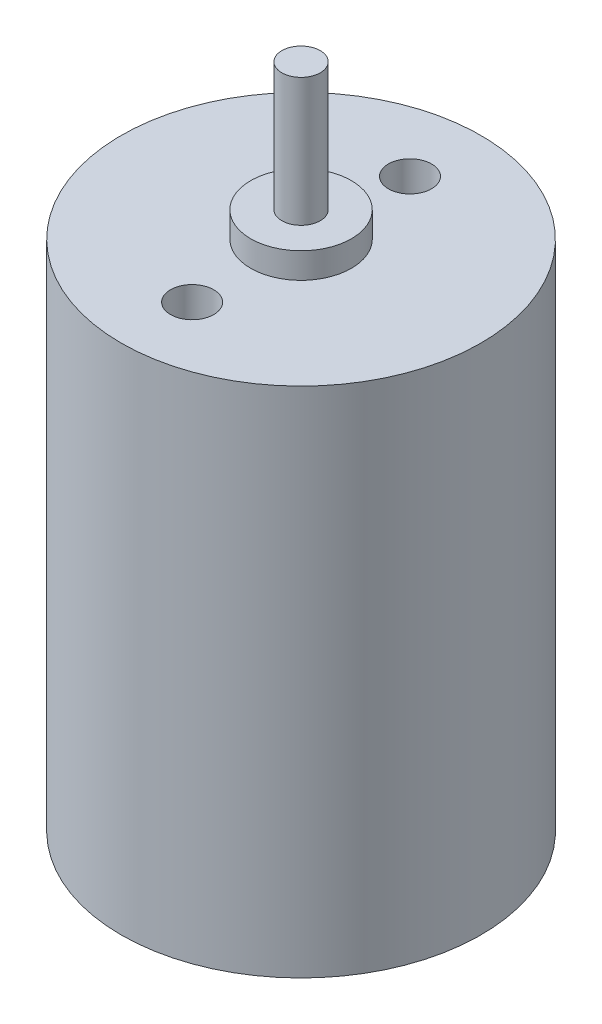
ISO-10303-21;
HEADER;
FILE_DESCRIPTION(('STEP AP214'),'2;1');
FILE_NAME('part.step','',(''),(''),'','','');
FILE_SCHEMA(('AUTOMOTIVE_DESIGN { 1 0 10303 214 1 1 1 1 }'));
ENDSEC;
DATA;
#1=APPLICATION_CONTEXT('core data for automotive mechanical design processes');
#2=APPLICATION_PROTOCOL_DEFINITION('international standard','automotive_design',2000,#1);
#3=PRODUCT_CONTEXT('',#1,'mechanical');
#4=PRODUCT('Part','Part','',(#3));
#5=PRODUCT_RELATED_PRODUCT_CATEGORY('part','',(#4));
#6=PRODUCT_DEFINITION_FORMATION('','',#4);
#7=PRODUCT_DEFINITION_CONTEXT('part definition',#1,'design');
#8=PRODUCT_DEFINITION('design','',#6,#7);
#9=PRODUCT_DEFINITION_SHAPE('','',#8);
#10=(LENGTH_UNIT() NAMED_UNIT(*) SI_UNIT(.MILLI.,.METRE.));
#11=(NAMED_UNIT(*) PLANE_ANGLE_UNIT() SI_UNIT($,.RADIAN.));
#12=(NAMED_UNIT(*) SI_UNIT($,.STERADIAN.) SOLID_ANGLE_UNIT());
#13=UNCERTAINTY_MEASURE_WITH_UNIT(LENGTH_MEASURE(1.E-05),#10,'distance_accuracy_value','');
#14=(GEOMETRIC_REPRESENTATION_CONTEXT(3) GLOBAL_UNCERTAINTY_ASSIGNED_CONTEXT((#13)) GLOBAL_UNIT_ASSIGNED_CONTEXT((#10,
#11,#12)) REPRESENTATION_CONTEXT('',''));
#15=CARTESIAN_POINT('',(0.,0.,0.));
#16=DIRECTION('',(0.,0.,1.));
#17=DIRECTION('',(1.,0.,0.));
#18=AXIS2_PLACEMENT_3D('',#15,#16,#17);
#19=CARTESIAN_POINT('',(0.,-40.,0.));
#20=DIRECTION('',(0.,1.,0.));
#21=DIRECTION('',(0.,0.,1.));
#22=AXIS2_PLACEMENT_3D('',#19,#20,#21);
#23=CYLINDRICAL_SURFACE('',#22,14.0362952781389);
#24=CARTESIAN_POINT('',(0.,-40.,0.));
#25=DIRECTION('',(0.,1.,0.));
#26=DIRECTION('',(0.,0.,1.));
#27=AXIS2_PLACEMENT_3D('',#24,#25,#26);
#28=CIRCLE('',#27,14.0362952781389);
#29=CARTESIAN_POINT('',(0.,-40.,14.0362952781389));
#30=VERTEX_POINT('',#29);
#31=EDGE_CURVE('E46',#30,#30,#28,.T.);
#32=ORIENTED_EDGE('',*,*,#31,.T.);
#33=EDGE_LOOP('',(#32));
#34=FACE_BOUND('',#33,.T.);
#35=CARTESIAN_POINT('',(0.,0.,0.));
#36=DIRECTION('',(0.,1.,0.));
#37=DIRECTION('',(0.,0.,1.));
#38=AXIS2_PLACEMENT_3D('',#35,#36,#37);
#39=CIRCLE('',#38,14.0362952781389);
#40=CARTESIAN_POINT('',(0.,0.,14.0362952781389));
#41=VERTEX_POINT('',#40);
#42=EDGE_CURVE('E51',#41,#41,#39,.T.);
#43=ORIENTED_EDGE('',*,*,#42,.F.);
#44=EDGE_LOOP('',(#43));
#45=FACE_BOUND('',#44,.T.);
#46=ADVANCED_FACE('F39',(#34,#45),#23,.T.);
#47=CARTESIAN_POINT('',(0.,-40.,0.));
#48=DIRECTION('',(0.,1.,0.));
#49=DIRECTION('',(0.,0.,1.));
#50=AXIS2_PLACEMENT_3D('',#47,#48,#49);
#51=PLANE('',#50);
#52=ORIENTED_EDGE('',*,*,#31,.F.);
#53=EDGE_LOOP('',(#52));
#54=FACE_BOUND('',#53,.T.);
#55=ADVANCED_FACE('F90',(#54),#51,.F.);
#56=CARTESIAN_POINT('',(0.,0.,0.));
#57=DIRECTION('',(0.,1.,0.));
#58=DIRECTION('',(0.,0.,1.));
#59=AXIS2_PLACEMENT_3D('',#56,#57,#58);
#60=PLANE('',#59);
#61=CARTESIAN_POINT('',(0.,0.,-8.5));
#62=DIRECTION('',(0.,1.,0.));
#63=DIRECTION('',(0.,0.,1.));
#64=AXIS2_PLACEMENT_3D('',#61,#62,#63);
#65=CIRCLE('',#64,1.68435543337666);
#66=CARTESIAN_POINT('',(0.,0.,-6.81564456662334));
#67=VERTEX_POINT('',#66);
#68=EDGE_CURVE('E72',#67,#67,#65,.T.);
#69=ORIENTED_EDGE('',*,*,#68,.F.);
#70=EDGE_LOOP('',(#69));
#71=FACE_BOUND('',#70,.T.);
#72=CARTESIAN_POINT('',(0.,0.,8.5));
#73=DIRECTION('',(0.,1.,0.));
#74=DIRECTION('',(0.,0.,1.));
#75=AXIS2_PLACEMENT_3D('',#72,#73,#74);
#76=CIRCLE('',#75,1.68435543337666);
#77=CARTESIAN_POINT('',(0.,0.,10.1843554333767));
#78=VERTEX_POINT('',#77);
#79=EDGE_CURVE('E79',#78,#78,#76,.T.);
#80=ORIENTED_EDGE('',*,*,#79,.F.);
#81=EDGE_LOOP('',(#80));
#82=FACE_BOUND('',#81,.T.);
#83=CARTESIAN_POINT('',(0.,0.,0.));
#84=DIRECTION('',(0.,1.,0.));
#85=DIRECTION('',(0.,0.,1.));
#86=AXIS2_PLACEMENT_3D('',#83,#84,#85);
#87=CIRCLE('',#86,3.93016267787888);
#88=CARTESIAN_POINT('',(0.,0.,3.93016267787888));
#89=VERTEX_POINT('',#88);
#90=EDGE_CURVE('E10',#89,#89,#87,.T.);
#91=ORIENTED_EDGE('',*,*,#90,.F.);
#92=EDGE_LOOP('',(#91));
#93=FACE_BOUND('',#92,.T.);
#94=ORIENTED_EDGE('',*,*,#42,.T.);
#95=EDGE_LOOP('',(#94));
#96=FACE_BOUND('',#95,.T.);
#97=ADVANCED_FACE('F83',(#71,#82,#93,#96),#60,.T.);
#98=CARTESIAN_POINT('',(0.,2.,0.));
#99=DIRECTION('',(0.,-1.,0.));
#100=DIRECTION('',(0.,0.,-1.));
#101=AXIS2_PLACEMENT_3D('',#98,#99,#100);
#102=CYLINDRICAL_SURFACE('',#101,3.93016267787888);
#103=CARTESIAN_POINT('',(0.,2.,0.));
#104=DIRECTION('',(0.,1.,0.));
#105=DIRECTION('',(0.,0.,1.));
#106=AXIS2_PLACEMENT_3D('',#103,#104,#105);
#107=CIRCLE('',#106,3.93016267787888);
#108=CARTESIAN_POINT('',(0.,2.,3.93016267787888));
#109=VERTEX_POINT('',#108);
#110=EDGE_CURVE('E53',#109,#109,#107,.T.);
#111=ORIENTED_EDGE('',*,*,#110,.F.);
#112=EDGE_LOOP('',(#111));
#113=FACE_BOUND('',#112,.T.);
#114=ORIENTED_EDGE('',*,*,#90,.T.);
#115=EDGE_LOOP('',(#114));
#116=FACE_BOUND('',#115,.T.);
#117=ADVANCED_FACE('F86',(#113,#116),#102,.T.);
#118=CARTESIAN_POINT('',(0.,2.,0.));
#119=DIRECTION('',(0.,1.,0.));
#120=DIRECTION('',(0.,0.,1.));
#121=AXIS2_PLACEMENT_3D('',#118,#119,#120);
#122=PLANE('',#121);
#123=CARTESIAN_POINT('',(0.,2.,0.));
#124=DIRECTION('',(0.,1.,0.));
#125=DIRECTION('',(0.,0.,1.));
#126=AXIS2_PLACEMENT_3D('',#123,#124,#125);
#127=CIRCLE('',#126,1.5);
#128=CARTESIAN_POINT('',(0.,2.,1.5));
#129=VERTEX_POINT('',#128);
#130=EDGE_CURVE('E45',#129,#129,#127,.F.);
#131=ORIENTED_EDGE('',*,*,#130,.T.);
#132=EDGE_LOOP('',(#131));
#133=FACE_BOUND('',#132,.T.);
#134=ORIENTED_EDGE('',*,*,#110,.T.);
#135=EDGE_LOOP('',(#134));
#136=FACE_BOUND('',#135,.T.);
#137=ADVANCED_FACE('F124',(#133,#136),#122,.T.);
#138=CARTESIAN_POINT('',(0.,12.,0.));
#139=DIRECTION('',(0.,-1.,0.));
#140=DIRECTION('',(0.,0.,-1.));
#141=AXIS2_PLACEMENT_3D('',#138,#139,#140);
#142=CYLINDRICAL_SURFACE('',#141,1.5);
#143=ORIENTED_EDGE('',*,*,#130,.F.);
#144=EDGE_LOOP('',(#143));
#145=FACE_BOUND('',#144,.T.);
#146=CARTESIAN_POINT('',(0.,12.,0.));
#147=DIRECTION('',(0.,1.,0.));
#148=DIRECTION('',(0.,0.,1.));
#149=AXIS2_PLACEMENT_3D('',#146,#147,#148);
#150=CIRCLE('',#149,1.5);
#151=CARTESIAN_POINT('',(0.,12.,1.5));
#152=VERTEX_POINT('',#151);
#153=EDGE_CURVE('E65',#152,#152,#150,.T.);
#154=ORIENTED_EDGE('',*,*,#153,.F.);
#155=EDGE_LOOP('',(#154));
#156=FACE_BOUND('',#155,.T.);
#157=ADVANCED_FACE('F104',(#145,#156),#142,.T.);
#158=CARTESIAN_POINT('',(0.,12.,0.));
#159=DIRECTION('',(0.,1.,0.));
#160=DIRECTION('',(0.,0.,1.));
#161=AXIS2_PLACEMENT_3D('',#158,#159,#160);
#162=PLANE('',#161);
#163=ORIENTED_EDGE('',*,*,#153,.T.);
#164=EDGE_LOOP('',(#163));
#165=FACE_BOUND('',#164,.T.);
#166=ADVANCED_FACE('F96',(#165),#162,.T.);
#167=CARTESIAN_POINT('',(0.,-6.,8.5));
#168=DIRECTION('',(0.,1.,0.));
#169=DIRECTION('',(0.,0.,1.));
#170=AXIS2_PLACEMENT_3D('',#167,#168,#169);
#171=CYLINDRICAL_SURFACE('',#170,1.68435543337666);
#172=CARTESIAN_POINT('',(0.,-6.,8.5));
#173=DIRECTION('',(0.,1.,0.));
#174=DIRECTION('',(0.,0.,1.));
#175=AXIS2_PLACEMENT_3D('',#172,#173,#174);
#176=CIRCLE('',#175,1.68435543337666);
#177=CARTESIAN_POINT('',(0.,-6.,10.1843554333767));
#178=VERTEX_POINT('',#177);
#179=EDGE_CURVE('E74',#178,#178,#176,.T.);
#180=ORIENTED_EDGE('',*,*,#179,.F.);
#181=EDGE_LOOP('',(#180));
#182=FACE_BOUND('',#181,.T.);
#183=ORIENTED_EDGE('',*,*,#79,.T.);
#184=EDGE_LOOP('',(#183));
#185=FACE_BOUND('',#184,.T.);
#186=ADVANCED_FACE('F91',(#182,#185),#171,.F.);
#187=CARTESIAN_POINT('',(0.,-6.,8.5));
#188=DIRECTION('',(0.,1.,0.));
#189=DIRECTION('',(0.,0.,1.));
#190=AXIS2_PLACEMENT_3D('',#187,#188,#189);
#191=PLANE('',#190);
#192=ORIENTED_EDGE('',*,*,#179,.T.);
#193=EDGE_LOOP('',(#192));
#194=FACE_BOUND('',#193,.T.);
#195=ADVANCED_FACE('F92',(#194),#191,.T.);
#196=CARTESIAN_POINT('',(0.,-6.,-8.5));
#197=DIRECTION('',(0.,1.,0.));
#198=DIRECTION('',(0.,0.,1.));
#199=AXIS2_PLACEMENT_3D('',#196,#197,#198);
#200=CYLINDRICAL_SURFACE('',#199,1.68435543337666);
#201=CARTESIAN_POINT('',(0.,-6.,-8.5));
#202=DIRECTION('',(0.,1.,0.));
#203=DIRECTION('',(0.,0.,1.));
#204=AXIS2_PLACEMENT_3D('',#201,#202,#203);
#205=CIRCLE('',#204,1.68435543337666);
#206=CARTESIAN_POINT('',(0.,-6.,-6.81564456662334));
#207=VERTEX_POINT('',#206);
#208=EDGE_CURVE('E70',#207,#207,#205,.T.);
#209=ORIENTED_EDGE('',*,*,#208,.F.);
#210=EDGE_LOOP('',(#209));
#211=FACE_BOUND('',#210,.T.);
#212=ORIENTED_EDGE('',*,*,#68,.T.);
#213=EDGE_LOOP('',(#212));
#214=FACE_BOUND('',#213,.T.);
#215=ADVANCED_FACE('F84',(#211,#214),#200,.F.);
#216=CARTESIAN_POINT('',(0.,-6.,-8.5));
#217=DIRECTION('',(0.,1.,0.));
#218=DIRECTION('',(0.,0.,1.));
#219=AXIS2_PLACEMENT_3D('',#216,#217,#218);
#220=PLANE('',#219);
#221=ORIENTED_EDGE('',*,*,#208,.T.);
#222=EDGE_LOOP('',(#221));
#223=FACE_BOUND('',#222,.T.);
#224=ADVANCED_FACE('F180',(#223),#220,.T.);
#225=CLOSED_SHELL('',(#46,#55,#97,#117,#137,#157,#166,#186,#195,#215,#224));
#226=MANIFOLD_SOLID_BREP('B2',#225);
#227=ADVANCED_BREP_SHAPE_REPRESENTATION('',(#18,#226),#14);
#228=SHAPE_DEFINITION_REPRESENTATION(#9,#227);
ENDSEC;
END-ISO-10303-21;
